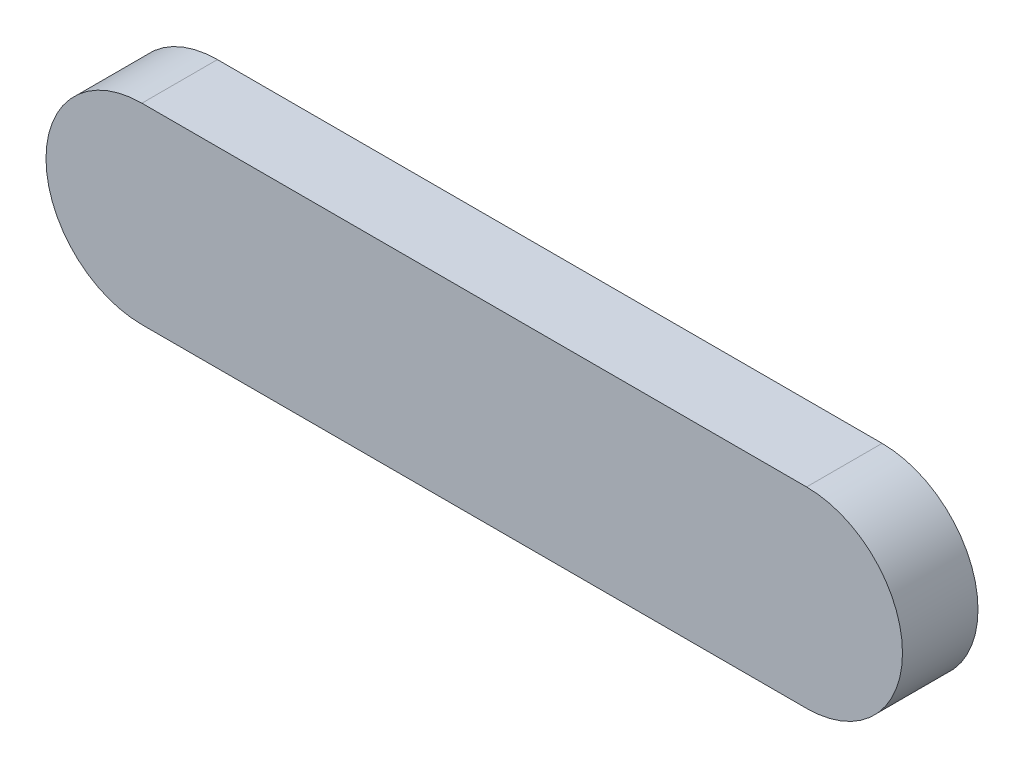
ISO-10303-21;
HEADER;
FILE_DESCRIPTION(('STEP AP214'),'2;1');
FILE_NAME('part.step','',(''),(''),'','','');
FILE_SCHEMA(('AUTOMOTIVE_DESIGN { 1 0 10303 214 1 1 1 1 }'));
ENDSEC;
DATA;
#1=APPLICATION_CONTEXT('core data for automotive mechanical design processes');
#2=APPLICATION_PROTOCOL_DEFINITION('international standard','automotive_design',2000,#1);
#3=PRODUCT_CONTEXT('',#1,'mechanical');
#4=PRODUCT('Part','Part','',(#3));
#5=PRODUCT_RELATED_PRODUCT_CATEGORY('part','',(#4));
#6=PRODUCT_DEFINITION_FORMATION('','',#4);
#7=PRODUCT_DEFINITION_CONTEXT('part definition',#1,'design');
#8=PRODUCT_DEFINITION('design','',#6,#7);
#9=PRODUCT_DEFINITION_SHAPE('','',#8);
#10=(LENGTH_UNIT() NAMED_UNIT(*) SI_UNIT(.MILLI.,.METRE.));
#11=(NAMED_UNIT(*) PLANE_ANGLE_UNIT() SI_UNIT($,.RADIAN.));
#12=(NAMED_UNIT(*) SI_UNIT($,.STERADIAN.) SOLID_ANGLE_UNIT());
#13=UNCERTAINTY_MEASURE_WITH_UNIT(LENGTH_MEASURE(1.E-05),#10,'distance_accuracy_value','');
#14=(GEOMETRIC_REPRESENTATION_CONTEXT(3) GLOBAL_UNCERTAINTY_ASSIGNED_CONTEXT((#13)) GLOBAL_UNIT_ASSIGNED_CONTEXT((#10,
#11,#12)) REPRESENTATION_CONTEXT('',''));
#15=CARTESIAN_POINT('',(0.,0.,0.));
#16=DIRECTION('',(0.,0.,1.));
#17=DIRECTION('',(1.,0.,0.));
#18=AXIS2_PLACEMENT_3D('',#15,#16,#17);
#19=CARTESIAN_POINT('',(93.10863776,65.786,0.));
#20=DIRECTION('',(0.,1.,0.));
#21=DIRECTION('',(1.,0.,0.));
#22=AXIS2_PLACEMENT_3D('',#19,#20,#21);
#23=PLANE('',#22);
#24=DIRECTION('',(1.,0.,0.));
#25=VECTOR('',#24,1.);
#26=CARTESIAN_POINT('',(93.10863776,65.786,0.1999996));
#27=LINE('',#26,#25);
#28=CARTESIAN_POINT('',(93.10863776,65.786,0.1999996));
#29=VERTEX_POINT('',#28);
#30=CARTESIAN_POINT('',(94.869,65.786,0.1999996));
#31=VERTEX_POINT('',#30);
#32=EDGE_CURVE('E11',#29,#31,#27,.T.);
#33=ORIENTED_EDGE('',*,*,#32,.F.);
#34=DIRECTION('',(0.,0.,1.));
#35=VECTOR('',#34,1.);
#36=CARTESIAN_POINT('',(93.10863776,65.786,0.));
#37=LINE('',#36,#35);
#38=CARTESIAN_POINT('',(93.10863776,65.786,0.));
#39=VERTEX_POINT('',#38);
#40=EDGE_CURVE('E24',#39,#29,#37,.T.);
#41=ORIENTED_EDGE('',*,*,#40,.F.);
#42=DIRECTION('',(1.,0.,0.));
#43=VECTOR('',#42,1.);
#44=CARTESIAN_POINT('',(93.10863776,65.786,0.));
#45=LINE('',#44,#43);
#46=CARTESIAN_POINT('',(94.869,65.786,0.));
#47=VERTEX_POINT('',#46);
#48=EDGE_CURVE('E75',#39,#47,#45,.T.);
#49=ORIENTED_EDGE('',*,*,#48,.T.);
#50=DIRECTION('',(0.,0.,1.));
#51=VECTOR('',#50,1.);
#52=CARTESIAN_POINT('',(94.869,65.786,0.));
#53=LINE('',#52,#51);
#54=EDGE_CURVE('E37',#47,#31,#53,.T.);
#55=ORIENTED_EDGE('',*,*,#54,.T.);
#56=EDGE_LOOP('',(#33,#41,#49,#55));
#57=FACE_BOUND('',#56,.T.);
#58=ADVANCED_FACE('F17',(#57),#23,.F.);
#59=CARTESIAN_POINT('',(94.869,66.04,0.));
#60=DIRECTION('',(0.,0.,-1.));
#61=DIRECTION('',(0.,-1.,0.));
#62=AXIS2_PLACEMENT_3D('',#59,#60,#61);
#63=CYLINDRICAL_SURFACE('',#62,0.253999999999995);
#64=CARTESIAN_POINT('',(94.869,66.04,0.1999996));
#65=DIRECTION('',(0.,0.,1.));
#66=DIRECTION('',(0.,-1.,0.));
#67=AXIS2_PLACEMENT_3D('',#64,#65,#66);
#68=CIRCLE('',#67,0.253999999999995);
#69=CARTESIAN_POINT('',(94.869,66.294,0.1999996));
#70=VERTEX_POINT('',#69);
#71=EDGE_CURVE('E83',#31,#70,#68,.T.);
#72=ORIENTED_EDGE('',*,*,#71,.F.);
#73=ORIENTED_EDGE('',*,*,#54,.F.);
#74=CARTESIAN_POINT('',(94.869,66.04,0.));
#75=DIRECTION('',(0.,0.,1.));
#76=DIRECTION('',(0.,-1.,0.));
#77=AXIS2_PLACEMENT_3D('',#74,#75,#76);
#78=CIRCLE('',#77,0.253999999999995);
#79=CARTESIAN_POINT('',(94.869,66.294,0.));
#80=VERTEX_POINT('',#79);
#81=EDGE_CURVE('E81',#47,#80,#78,.T.);
#82=ORIENTED_EDGE('',*,*,#81,.T.);
#83=DIRECTION('',(0.,0.,1.));
#84=VECTOR('',#83,1.);
#85=CARTESIAN_POINT('',(94.869,66.294,0.));
#86=LINE('',#85,#84);
#87=EDGE_CURVE('E67',#80,#70,#86,.T.);
#88=ORIENTED_EDGE('',*,*,#87,.T.);
#89=EDGE_LOOP('',(#72,#73,#82,#88));
#90=FACE_BOUND('',#89,.T.);
#91=ADVANCED_FACE('F89',(#90),#63,.T.);
#92=CARTESIAN_POINT('',(94.869,66.294,0.));
#93=DIRECTION('',(0.,-1.,0.));
#94=DIRECTION('',(-1.,0.,0.));
#95=AXIS2_PLACEMENT_3D('',#92,#93,#94);
#96=PLANE('',#95);
#97=DIRECTION('',(-1.,0.,0.));
#98=VECTOR('',#97,1.);
#99=CARTESIAN_POINT('',(94.869,66.294,0.1999996));
#100=LINE('',#99,#98);
#101=CARTESIAN_POINT('',(93.10863776,66.294,0.1999996));
#102=VERTEX_POINT('',#101);
#103=EDGE_CURVE('E71',#70,#102,#100,.T.);
#104=ORIENTED_EDGE('',*,*,#103,.F.);
#105=ORIENTED_EDGE('',*,*,#87,.F.);
#106=DIRECTION('',(-1.,0.,0.));
#107=VECTOR('',#106,1.);
#108=CARTESIAN_POINT('',(94.869,66.294,0.));
#109=LINE('',#108,#107);
#110=CARTESIAN_POINT('',(93.10863776,66.294,0.));
#111=VERTEX_POINT('',#110);
#112=EDGE_CURVE('E63',#80,#111,#109,.T.);
#113=ORIENTED_EDGE('',*,*,#112,.T.);
#114=DIRECTION('',(0.,0.,1.));
#115=VECTOR('',#114,1.);
#116=CARTESIAN_POINT('',(93.10863776,66.294,0.));
#117=LINE('',#116,#115);
#118=EDGE_CURVE('E53',#111,#102,#117,.T.);
#119=ORIENTED_EDGE('',*,*,#118,.T.);
#120=EDGE_LOOP('',(#104,#105,#113,#119));
#121=FACE_BOUND('',#120,.T.);
#122=ADVANCED_FACE('F66',(#121),#96,.F.);
#123=CARTESIAN_POINT('',(93.10863776,66.04,0.));
#124=DIRECTION('',(0.,0.,-1.));
#125=DIRECTION('',(0.,1.,0.));
#126=AXIS2_PLACEMENT_3D('',#123,#124,#125);
#127=CYLINDRICAL_SURFACE('',#126,0.254);
#128=CARTESIAN_POINT('',(93.10863776,66.04,0.1999996));
#129=DIRECTION('',(0.,0.,1.));
#130=DIRECTION('',(0.,1.,0.));
#131=AXIS2_PLACEMENT_3D('',#128,#129,#130);
#132=CIRCLE('',#131,0.254);
#133=EDGE_CURVE('E59',#102,#29,#132,.T.);
#134=ORIENTED_EDGE('',*,*,#133,.F.);
#135=ORIENTED_EDGE('',*,*,#118,.F.);
#136=CARTESIAN_POINT('',(93.10863776,66.04,0.));
#137=DIRECTION('',(0.,0.,1.));
#138=DIRECTION('',(0.,1.,0.));
#139=AXIS2_PLACEMENT_3D('',#136,#137,#138);
#140=CIRCLE('',#139,0.254);
#141=EDGE_CURVE('E57',#111,#39,#140,.T.);
#142=ORIENTED_EDGE('',*,*,#141,.T.);
#143=ORIENTED_EDGE('',*,*,#40,.T.);
#144=EDGE_LOOP('',(#134,#135,#142,#143));
#145=FACE_BOUND('',#144,.T.);
#146=ADVANCED_FACE('F55',(#145),#127,.T.);
#147=CARTESIAN_POINT('',(93.10863776,65.786,0.));
#148=DIRECTION('',(0.,0.,-1.));
#149=DIRECTION('',(-1.,0.,0.));
#150=AXIS2_PLACEMENT_3D('',#147,#148,#149);
#151=PLANE('',#150);
#152=ORIENTED_EDGE('',*,*,#141,.F.);
#153=ORIENTED_EDGE('',*,*,#112,.F.);
#154=ORIENTED_EDGE('',*,*,#81,.F.);
#155=ORIENTED_EDGE('',*,*,#48,.F.);
#156=EDGE_LOOP('',(#152,#153,#154,#155));
#157=FACE_BOUND('',#156,.T.);
#158=ADVANCED_FACE('F74',(#157),#151,.T.);
#159=CARTESIAN_POINT('',(93.10863776,65.786,0.1999996));
#160=DIRECTION('',(0.,0.,-1.));
#161=DIRECTION('',(-1.,0.,0.));
#162=AXIS2_PLACEMENT_3D('',#159,#160,#161);
#163=PLANE('',#162);
#164=ORIENTED_EDGE('',*,*,#32,.T.);
#165=ORIENTED_EDGE('',*,*,#71,.T.);
#166=ORIENTED_EDGE('',*,*,#103,.T.);
#167=ORIENTED_EDGE('',*,*,#133,.T.);
#168=EDGE_LOOP('',(#164,#165,#166,#167));
#169=FACE_BOUND('',#168,.T.);
#170=ADVANCED_FACE('F91',(#169),#163,.F.);
#171=CLOSED_SHELL('',(#58,#91,#122,#146,#158,#170));
#172=MANIFOLD_SOLID_BREP('B1',#171);
#173=ADVANCED_BREP_SHAPE_REPRESENTATION('',(#18,#172),#14);
#174=SHAPE_DEFINITION_REPRESENTATION(#9,#173);
ENDSEC;
END-ISO-10303-21;
